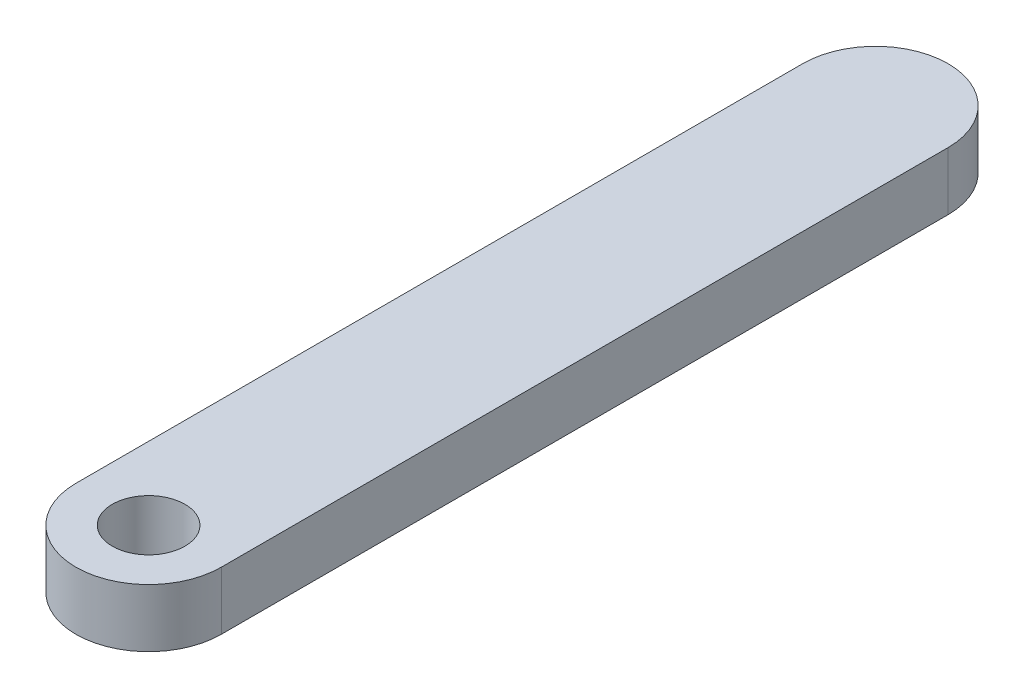
ISO-10303-21;
HEADER;
FILE_DESCRIPTION(('STEP AP214'),'2;1');
FILE_NAME('part.step','',(''),(''),'','','');
FILE_SCHEMA(('AUTOMOTIVE_DESIGN { 1 0 10303 214 1 1 1 1 }'));
ENDSEC;
DATA;
#1=APPLICATION_CONTEXT('core data for automotive mechanical design processes');
#2=APPLICATION_PROTOCOL_DEFINITION('international standard','automotive_design',2000,#1);
#3=PRODUCT_CONTEXT('',#1,'mechanical');
#4=PRODUCT('Part','Part','',(#3));
#5=PRODUCT_RELATED_PRODUCT_CATEGORY('part','',(#4));
#6=PRODUCT_DEFINITION_FORMATION('','',#4);
#7=PRODUCT_DEFINITION_CONTEXT('part definition',#1,'design');
#8=PRODUCT_DEFINITION('design','',#6,#7);
#9=PRODUCT_DEFINITION_SHAPE('','',#8);
#10=(LENGTH_UNIT() NAMED_UNIT(*) SI_UNIT(.MILLI.,.METRE.));
#11=(NAMED_UNIT(*) PLANE_ANGLE_UNIT() SI_UNIT($,.RADIAN.));
#12=(NAMED_UNIT(*) SI_UNIT($,.STERADIAN.) SOLID_ANGLE_UNIT());
#13=UNCERTAINTY_MEASURE_WITH_UNIT(LENGTH_MEASURE(1.E-05),#10,'distance_accuracy_value','');
#14=(GEOMETRIC_REPRESENTATION_CONTEXT(3) GLOBAL_UNCERTAINTY_ASSIGNED_CONTEXT((#13)) GLOBAL_UNIT_ASSIGNED_CONTEXT((#10,
#11,#12)) REPRESENTATION_CONTEXT('',''));
#15=CARTESIAN_POINT('',(0.,0.,0.));
#16=DIRECTION('',(0.,0.,1.));
#17=DIRECTION('',(1.,0.,0.));
#18=AXIS2_PLACEMENT_3D('',#15,#16,#17);
#19=CARTESIAN_POINT('',(0.,8.,0.));
#20=DIRECTION('',(0.,-1.,0.));
#21=DIRECTION('',(0.,0.,-1.));
#22=AXIS2_PLACEMENT_3D('',#19,#20,#21);
#23=PLANE('',#22);
#24=CARTESIAN_POINT('',(0.,8.,0.));
#25=DIRECTION('',(0.,1.,0.));
#26=DIRECTION('',(0.,0.,-1.));
#27=AXIS2_PLACEMENT_3D('',#24,#25,#26);
#28=CIRCLE('',#27,10.);
#29=CARTESIAN_POINT('',(-10.,8.,0.));
#30=VERTEX_POINT('',#29);
#31=CARTESIAN_POINT('',(10.,8.,0.));
#32=VERTEX_POINT('',#31);
#33=EDGE_CURVE('E91',#30,#32,#28,.T.);
#34=ORIENTED_EDGE('',*,*,#33,.T.);
#35=DIRECTION('',(0.,0.,-1.));
#36=VECTOR('',#35,1.);
#37=CARTESIAN_POINT('',(10.,8.,-100.));
#38=LINE('',#37,#36);
#39=CARTESIAN_POINT('',(10.,8.,-100.));
#40=VERTEX_POINT('',#39);
#41=EDGE_CURVE('E86',#32,#40,#38,.T.);
#42=ORIENTED_EDGE('',*,*,#41,.T.);
#43=CARTESIAN_POINT('',(0.,8.,-100.));
#44=DIRECTION('',(0.,1.,0.));
#45=DIRECTION('',(0.,0.,-1.));
#46=AXIS2_PLACEMENT_3D('',#43,#44,#45);
#47=CIRCLE('',#46,10.);
#48=CARTESIAN_POINT('',(-10.,8.,-100.));
#49=VERTEX_POINT('',#48);
#50=EDGE_CURVE('E89',#40,#49,#47,.T.);
#51=ORIENTED_EDGE('',*,*,#50,.T.);
#52=DIRECTION('',(0.,0.,1.));
#53=VECTOR('',#52,1.);
#54=CARTESIAN_POINT('',(-10.,8.,0.));
#55=LINE('',#54,#53);
#56=EDGE_CURVE('E56',#49,#30,#55,.T.);
#57=ORIENTED_EDGE('',*,*,#56,.T.);
#58=EDGE_LOOP('',(#34,#42,#51,#57));
#59=FACE_BOUND('',#58,.T.);
#60=CARTESIAN_POINT('',(0.,8.,0.));
#61=DIRECTION('',(0.,1.,0.));
#62=DIRECTION('',(0.,0.,1.));
#63=AXIS2_PLACEMENT_3D('',#60,#61,#62);
#64=CIRCLE('',#63,5.);
#65=CARTESIAN_POINT('',(0.,8.,5.));
#66=VERTEX_POINT('',#65);
#67=EDGE_CURVE('E106',#66,#66,#64,.T.);
#68=ORIENTED_EDGE('',*,*,#67,.F.);
#69=EDGE_LOOP('',(#68));
#70=FACE_BOUND('',#69,.T.);
#71=ADVANCED_FACE('F39',(#59,#70),#23,.F.);
#72=CARTESIAN_POINT('',(0.,0.,0.));
#73=DIRECTION('',(0.,-1.,0.));
#74=DIRECTION('',(0.,0.,-1.));
#75=AXIS2_PLACEMENT_3D('',#72,#73,#74);
#76=PLANE('',#75);
#77=CARTESIAN_POINT('',(0.,0.,0.));
#78=DIRECTION('',(0.,1.,0.));
#79=DIRECTION('',(0.,0.,-1.));
#80=AXIS2_PLACEMENT_3D('',#77,#78,#79);
#81=CIRCLE('',#80,10.);
#82=CARTESIAN_POINT('',(-10.,0.,0.));
#83=VERTEX_POINT('',#82);
#84=CARTESIAN_POINT('',(10.,0.,0.));
#85=VERTEX_POINT('',#84);
#86=EDGE_CURVE('E103',#83,#85,#81,.T.);
#87=ORIENTED_EDGE('',*,*,#86,.F.);
#88=DIRECTION('',(0.,0.,1.));
#89=VECTOR('',#88,1.);
#90=CARTESIAN_POINT('',(-10.,0.,0.));
#91=LINE('',#90,#89);
#92=CARTESIAN_POINT('',(-10.,0.,-100.));
#93=VERTEX_POINT('',#92);
#94=EDGE_CURVE('E79',#93,#83,#91,.T.);
#95=ORIENTED_EDGE('',*,*,#94,.F.);
#96=CARTESIAN_POINT('',(0.,0.,-100.));
#97=DIRECTION('',(0.,1.,0.));
#98=DIRECTION('',(0.,0.,-1.));
#99=AXIS2_PLACEMENT_3D('',#96,#97,#98);
#100=CIRCLE('',#99,10.);
#101=CARTESIAN_POINT('',(10.,0.,-100.));
#102=VERTEX_POINT('',#101);
#103=EDGE_CURVE('E73',#102,#93,#100,.T.);
#104=ORIENTED_EDGE('',*,*,#103,.F.);
#105=DIRECTION('',(0.,0.,-1.));
#106=VECTOR('',#105,1.);
#107=CARTESIAN_POINT('',(10.,0.,-100.));
#108=LINE('',#107,#106);
#109=EDGE_CURVE('E95',#85,#102,#108,.T.);
#110=ORIENTED_EDGE('',*,*,#109,.F.);
#111=EDGE_LOOP('',(#87,#95,#104,#110));
#112=FACE_BOUND('',#111,.T.);
#113=CARTESIAN_POINT('',(0.,0.,0.));
#114=DIRECTION('',(0.,1.,0.));
#115=DIRECTION('',(0.,0.,1.));
#116=AXIS2_PLACEMENT_3D('',#113,#114,#115);
#117=CIRCLE('',#116,5.);
#118=CARTESIAN_POINT('',(0.,0.,5.));
#119=VERTEX_POINT('',#118);
#120=EDGE_CURVE('E118',#119,#119,#117,.T.);
#121=ORIENTED_EDGE('',*,*,#120,.T.);
#122=EDGE_LOOP('',(#121));
#123=FACE_BOUND('',#122,.T.);
#124=ADVANCED_FACE('F114',(#112,#123),#76,.T.);
#125=CARTESIAN_POINT('',(0.,8.,0.));
#126=DIRECTION('',(0.,-1.,0.));
#127=DIRECTION('',(0.,0.,-1.));
#128=AXIS2_PLACEMENT_3D('',#125,#126,#127);
#129=CYLINDRICAL_SURFACE('',#128,10.);
#130=ORIENTED_EDGE('',*,*,#86,.T.);
#131=DIRECTION('',(0.,-1.,0.));
#132=VECTOR('',#131,1.);
#133=CARTESIAN_POINT('',(10.,8.,0.));
#134=LINE('',#133,#132);
#135=EDGE_CURVE('E11',#32,#85,#134,.T.);
#136=ORIENTED_EDGE('',*,*,#135,.F.);
#137=ORIENTED_EDGE('',*,*,#33,.F.);
#138=DIRECTION('',(0.,-1.,0.));
#139=VECTOR('',#138,1.);
#140=CARTESIAN_POINT('',(-10.,8.,0.));
#141=LINE('',#140,#139);
#142=EDGE_CURVE('E99',#30,#83,#141,.T.);
#143=ORIENTED_EDGE('',*,*,#142,.T.);
#144=EDGE_LOOP('',(#130,#136,#137,#143));
#145=FACE_BOUND('',#144,.T.);
#146=ADVANCED_FACE('F41',(#145),#129,.T.);
#147=CARTESIAN_POINT('',(10.,8.,-100.));
#148=DIRECTION('',(-1.,0.,0.));
#149=DIRECTION('',(0.,0.,1.));
#150=AXIS2_PLACEMENT_3D('',#147,#148,#149);
#151=PLANE('',#150);
#152=ORIENTED_EDGE('',*,*,#109,.T.);
#153=DIRECTION('',(0.,-1.,0.));
#154=VECTOR('',#153,1.);
#155=CARTESIAN_POINT('',(10.,8.,-100.));
#156=LINE('',#155,#154);
#157=EDGE_CURVE('E48',#40,#102,#156,.T.);
#158=ORIENTED_EDGE('',*,*,#157,.F.);
#159=ORIENTED_EDGE('',*,*,#41,.F.);
#160=ORIENTED_EDGE('',*,*,#135,.T.);
#161=EDGE_LOOP('',(#152,#158,#159,#160));
#162=FACE_BOUND('',#161,.T.);
#163=ADVANCED_FACE('F94',(#162),#151,.F.);
#164=CARTESIAN_POINT('',(0.,8.,-100.));
#165=DIRECTION('',(0.,-1.,0.));
#166=DIRECTION('',(0.,0.,-1.));
#167=AXIS2_PLACEMENT_3D('',#164,#165,#166);
#168=CYLINDRICAL_SURFACE('',#167,10.);
#169=ORIENTED_EDGE('',*,*,#103,.T.);
#170=DIRECTION('',(0.,-1.,0.));
#171=VECTOR('',#170,1.);
#172=CARTESIAN_POINT('',(-10.,8.,-100.));
#173=LINE('',#172,#171);
#174=EDGE_CURVE('E96',#49,#93,#173,.T.);
#175=ORIENTED_EDGE('',*,*,#174,.F.);
#176=ORIENTED_EDGE('',*,*,#50,.F.);
#177=ORIENTED_EDGE('',*,*,#157,.T.);
#178=EDGE_LOOP('',(#169,#175,#176,#177));
#179=FACE_BOUND('',#178,.T.);
#180=ADVANCED_FACE('F97',(#179),#168,.T.);
#181=CARTESIAN_POINT('',(-10.,8.,0.));
#182=DIRECTION('',(1.,0.,0.));
#183=DIRECTION('',(0.,0.,-1.));
#184=AXIS2_PLACEMENT_3D('',#181,#182,#183);
#185=PLANE('',#184);
#186=ORIENTED_EDGE('',*,*,#94,.T.);
#187=ORIENTED_EDGE('',*,*,#142,.F.);
#188=ORIENTED_EDGE('',*,*,#56,.F.);
#189=ORIENTED_EDGE('',*,*,#174,.T.);
#190=EDGE_LOOP('',(#186,#187,#188,#189));
#191=FACE_BOUND('',#190,.T.);
#192=ADVANCED_FACE('F111',(#191),#185,.F.);
#193=CARTESIAN_POINT('',(0.,8.,0.));
#194=DIRECTION('',(0.,-1.,0.));
#195=DIRECTION('',(0.,0.,-1.));
#196=AXIS2_PLACEMENT_3D('',#193,#194,#195);
#197=CYLINDRICAL_SURFACE('',#196,5.);
#198=ORIENTED_EDGE('',*,*,#67,.T.);
#199=EDGE_LOOP('',(#198));
#200=FACE_BOUND('',#199,.T.);
#201=ORIENTED_EDGE('',*,*,#120,.F.);
#202=EDGE_LOOP('',(#201));
#203=FACE_BOUND('',#202,.T.);
#204=ADVANCED_FACE('F124',(#200,#203),#197,.F.);
#205=CLOSED_SHELL('',(#71,#124,#146,#163,#180,#192,#204));
#206=MANIFOLD_SOLID_BREP('B2',#205);
#207=ADVANCED_BREP_SHAPE_REPRESENTATION('',(#18,#206),#14);
#208=SHAPE_DEFINITION_REPRESENTATION(#9,#207);
ENDSEC;
END-ISO-10303-21;
